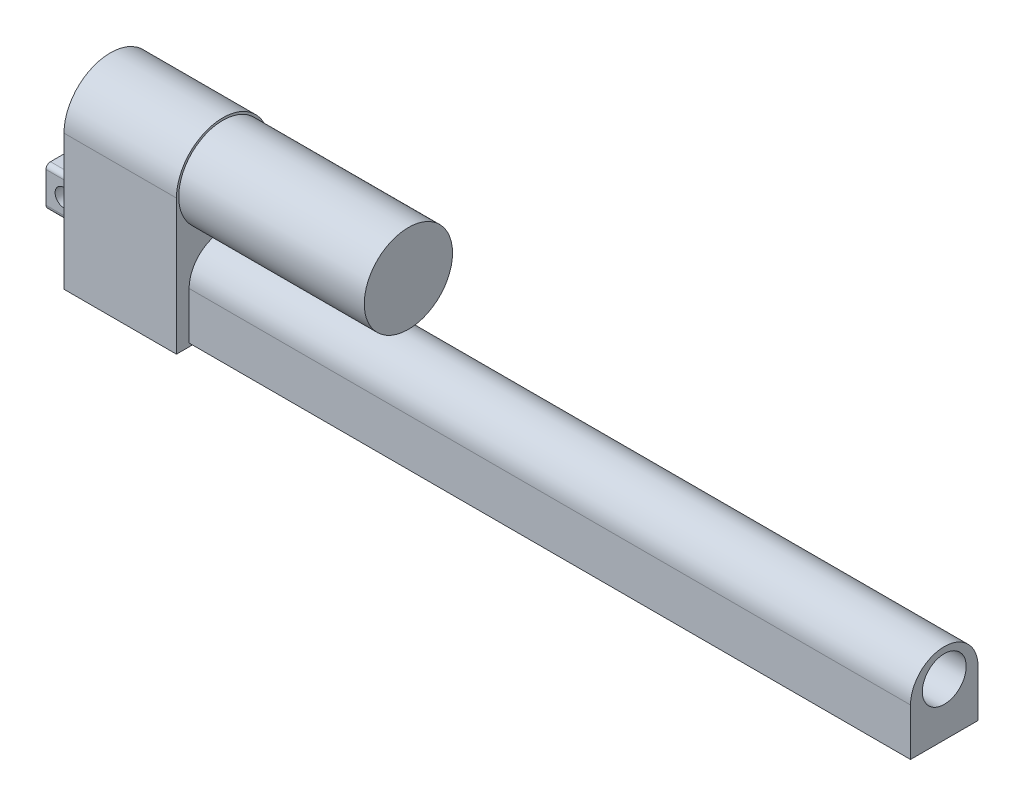
ISO-10303-21;
HEADER;
FILE_DESCRIPTION(('STEP AP214'),'2;1');
FILE_NAME('part.step','',(''),(''),'','','');
FILE_SCHEMA(('AUTOMOTIVE_DESIGN { 1 0 10303 214 1 1 1 1 }'));
ENDSEC;
DATA;
#1=APPLICATION_CONTEXT('core data for automotive mechanical design processes');
#2=APPLICATION_PROTOCOL_DEFINITION('international standard','automotive_design',2000,#1);
#3=PRODUCT_CONTEXT('',#1,'mechanical');
#4=PRODUCT('Part','Part','',(#3));
#5=PRODUCT_RELATED_PRODUCT_CATEGORY('part','',(#4));
#6=PRODUCT_DEFINITION_FORMATION('','',#4);
#7=PRODUCT_DEFINITION_CONTEXT('part definition',#1,'design');
#8=PRODUCT_DEFINITION('design','',#6,#7);
#9=PRODUCT_DEFINITION_SHAPE('','',#8);
#10=(LENGTH_UNIT() NAMED_UNIT(*) SI_UNIT(.MILLI.,.METRE.));
#11=(NAMED_UNIT(*) PLANE_ANGLE_UNIT() SI_UNIT($,.RADIAN.));
#12=(NAMED_UNIT(*) SI_UNIT($,.STERADIAN.) SOLID_ANGLE_UNIT());
#13=UNCERTAINTY_MEASURE_WITH_UNIT(LENGTH_MEASURE(1.E-05),#10,'distance_accuracy_value','');
#14=(GEOMETRIC_REPRESENTATION_CONTEXT(3) GLOBAL_UNCERTAINTY_ASSIGNED_CONTEXT((#13)) GLOBAL_UNIT_ASSIGNED_CONTEXT((#10,
#11,#12)) REPRESENTATION_CONTEXT('',''));
#15=CARTESIAN_POINT('',(0.,0.,0.));
#16=DIRECTION('',(0.,0.,1.));
#17=DIRECTION('',(1.,0.,0.));
#18=AXIS2_PLACEMENT_3D('',#15,#16,#17);
#19=CARTESIAN_POINT('',(0.,0.,0.));
#20=DIRECTION('',(1.,0.,0.));
#21=DIRECTION('',(0.,0.,-1.));
#22=AXIS2_PLACEMENT_3D('',#19,#20,#21);
#23=PLANE('',#22);
#24=CARTESIAN_POINT('',(0.,0.,0.));
#25=DIRECTION('',(1.,0.,0.));
#26=DIRECTION('',(0.,0.,-1.));
#27=AXIS2_PLACEMENT_3D('',#24,#25,#26);
#28=CIRCLE('',#27,20.955);
#29=CARTESIAN_POINT('',(0.,0.,-20.955));
#30=VERTEX_POINT('',#29);
#31=CARTESIAN_POINT('',(0.,0.,20.955));
#32=VERTEX_POINT('',#31);
#33=EDGE_CURVE('E180',#30,#32,#28,.T.);
#34=ORIENTED_EDGE('',*,*,#33,.F.);
#35=DIRECTION('',(0.,1.,0.));
#36=VECTOR('',#35,1.);
#37=CARTESIAN_POINT('',(0.,0.,-20.955));
#38=LINE('',#37,#36);
#39=CARTESIAN_POINT('',(0.,-61.087,-20.955));
#40=VERTEX_POINT('',#39);
#41=EDGE_CURVE('E186',#40,#30,#38,.T.);
#42=ORIENTED_EDGE('',*,*,#41,.F.);
#43=DIRECTION('',(0.,0.,-1.));
#44=VECTOR('',#43,1.);
#45=CARTESIAN_POINT('',(0.,-61.087,20.955));
#46=LINE('',#45,#44);
#47=CARTESIAN_POINT('',(0.,-61.087,20.955));
#48=VERTEX_POINT('',#47);
#49=EDGE_CURVE('E197',#48,#40,#46,.T.);
#50=ORIENTED_EDGE('',*,*,#49,.F.);
#51=DIRECTION('',(0.,-1.,0.));
#52=VECTOR('',#51,1.);
#53=CARTESIAN_POINT('',(0.,0.,20.955));
#54=LINE('',#53,#52);
#55=EDGE_CURVE('E195',#32,#48,#54,.T.);
#56=ORIENTED_EDGE('',*,*,#55,.F.);
#57=EDGE_LOOP('',(#34,#42,#50,#56));
#58=FACE_BOUND('',#57,.T.);
#59=DIRECTION('',(0.,-1.,0.));
#60=VECTOR('',#59,1.);
#61=CARTESIAN_POINT('',(0.,-28.194,-9.017));
#62=LINE('',#61,#60);
#63=CARTESIAN_POINT('',(0.,-30.226,-9.017));
#64=VERTEX_POINT('',#63);
#65=CARTESIAN_POINT('',(0.,-44.196,-9.017));
#66=VERTEX_POINT('',#65);
#67=EDGE_CURVE('E243',#64,#66,#62,.T.);
#68=ORIENTED_EDGE('',*,*,#67,.F.);
#69=CARTESIAN_POINT('',(0.,-30.226,-6.985));
#70=DIRECTION('',(1.,0.,0.));
#71=DIRECTION('',(0.,0.,-1.));
#72=AXIS2_PLACEMENT_3D('',#69,#70,#71);
#73=CIRCLE('',#72,2.032);
#74=CARTESIAN_POINT('',(0.,-28.194,-6.985));
#75=VERTEX_POINT('',#74);
#76=EDGE_CURVE('E41',#64,#75,#73,.T.);
#77=ORIENTED_EDGE('',*,*,#76,.T.);
#78=DIRECTION('',(0.,0.,-1.));
#79=VECTOR('',#78,1.);
#80=CARTESIAN_POINT('',(0.,-28.194,-9.017));
#81=LINE('',#80,#79);
#82=CARTESIAN_POINT('',(0.,-28.194,6.985));
#83=VERTEX_POINT('',#82);
#84=EDGE_CURVE('E273',#83,#75,#81,.T.);
#85=ORIENTED_EDGE('',*,*,#84,.F.);
#86=CARTESIAN_POINT('',(0.,-30.226,6.985));
#87=DIRECTION('',(1.,0.,0.));
#88=DIRECTION('',(0.,0.,-1.));
#89=AXIS2_PLACEMENT_3D('',#86,#87,#88);
#90=CIRCLE('',#89,2.032);
#91=CARTESIAN_POINT('',(0.,-30.226,9.017));
#92=VERTEX_POINT('',#91);
#93=EDGE_CURVE('E11',#83,#92,#90,.T.);
#94=ORIENTED_EDGE('',*,*,#93,.T.);
#95=DIRECTION('',(0.,1.,0.));
#96=VECTOR('',#95,1.);
#97=CARTESIAN_POINT('',(0.,-28.194,9.017));
#98=LINE('',#97,#96);
#99=CARTESIAN_POINT('',(0.,-44.196,9.017));
#100=VERTEX_POINT('',#99);
#101=EDGE_CURVE('E280',#100,#92,#98,.T.);
#102=ORIENTED_EDGE('',*,*,#101,.F.);
#103=CARTESIAN_POINT('',(0.,-44.196,6.98500000000001));
#104=DIRECTION('',(1.,0.,0.));
#105=DIRECTION('',(0.,0.,-1.));
#106=AXIS2_PLACEMENT_3D('',#103,#104,#105);
#107=CIRCLE('',#106,2.032);
#108=CARTESIAN_POINT('',(0.,-46.228,6.98500000000001));
#109=VERTEX_POINT('',#108);
#110=EDGE_CURVE('E238',#100,#109,#107,.T.);
#111=ORIENTED_EDGE('',*,*,#110,.T.);
#112=DIRECTION('',(0.,0.,1.));
#113=VECTOR('',#112,1.);
#114=CARTESIAN_POINT('',(0.,-46.228,-9.017));
#115=LINE('',#114,#113);
#116=CARTESIAN_POINT('',(0.,-46.228,-6.985));
#117=VERTEX_POINT('',#116);
#118=EDGE_CURVE('E245',#117,#109,#115,.T.);
#119=ORIENTED_EDGE('',*,*,#118,.F.);
#120=CARTESIAN_POINT('',(0.,-44.196,-6.985));
#121=DIRECTION('',(1.,0.,0.));
#122=DIRECTION('',(0.,0.,-1.));
#123=AXIS2_PLACEMENT_3D('',#120,#121,#122);
#124=CIRCLE('',#123,2.032);
#125=EDGE_CURVE('E240',#117,#66,#124,.T.);
#126=ORIENTED_EDGE('',*,*,#125,.T.);
#127=EDGE_LOOP('',(#68,#77,#85,#94,#102,#111,#119,#126));
#128=FACE_BOUND('',#127,.T.);
#129=ADVANCED_FACE('F33',(#58,#128),#23,.F.);
#130=CARTESIAN_POINT('',(50.8,0.,0.));
#131=DIRECTION('',(1.,0.,0.));
#132=DIRECTION('',(0.,0.,-1.));
#133=AXIS2_PLACEMENT_3D('',#130,#131,#132);
#134=PLANE('',#133);
#135=CARTESIAN_POINT('',(50.8,0.,0.));
#136=DIRECTION('',(1.,0.,0.));
#137=DIRECTION('',(0.,0.,-1.));
#138=AXIS2_PLACEMENT_3D('',#135,#136,#137);
#139=CIRCLE('',#138,19.939);
#140=CARTESIAN_POINT('',(50.8,0.,-19.939));
#141=VERTEX_POINT('',#140);
#142=EDGE_CURVE('E170',#141,#141,#139,.T.);
#143=ORIENTED_EDGE('',*,*,#142,.F.);
#144=EDGE_LOOP('',(#143));
#145=FACE_BOUND('',#144,.T.);
#146=CARTESIAN_POINT('',(50.8,0.,0.));
#147=DIRECTION('',(1.,0.,0.));
#148=DIRECTION('',(0.,0.,-1.));
#149=AXIS2_PLACEMENT_3D('',#146,#147,#148);
#150=CIRCLE('',#149,20.955);
#151=CARTESIAN_POINT('',(50.8,0.,-20.955));
#152=VERTEX_POINT('',#151);
#153=CARTESIAN_POINT('',(50.8,0.,20.955));
#154=VERTEX_POINT('',#153);
#155=EDGE_CURVE('E182',#152,#154,#150,.T.);
#156=ORIENTED_EDGE('',*,*,#155,.T.);
#157=DIRECTION('',(0.,-1.,0.));
#158=VECTOR('',#157,1.);
#159=CARTESIAN_POINT('',(50.8,0.,20.955));
#160=LINE('',#159,#158);
#161=CARTESIAN_POINT('',(50.8,-61.087,20.955));
#162=VERTEX_POINT('',#161);
#163=EDGE_CURVE('E185',#154,#162,#160,.T.);
#164=ORIENTED_EDGE('',*,*,#163,.T.);
#165=DIRECTION('',(0.,0.,-1.));
#166=VECTOR('',#165,1.);
#167=CARTESIAN_POINT('',(50.8,-61.087,20.955));
#168=LINE('',#167,#166);
#169=CARTESIAN_POINT('',(50.8,-61.087,-20.955));
#170=VERTEX_POINT('',#169);
#171=EDGE_CURVE('E188',#162,#170,#168,.T.);
#172=ORIENTED_EDGE('',*,*,#171,.T.);
#173=DIRECTION('',(0.,1.,0.));
#174=VECTOR('',#173,1.);
#175=CARTESIAN_POINT('',(50.8,0.,-20.955));
#176=LINE('',#175,#174);
#177=EDGE_CURVE('E190',#170,#152,#176,.T.);
#178=ORIENTED_EDGE('',*,*,#177,.T.);
#179=EDGE_LOOP('',(#156,#164,#172,#178));
#180=FACE_BOUND('',#179,.T.);
#181=DIRECTION('',(0.,-1.,0.));
#182=VECTOR('',#181,1.);
#183=CARTESIAN_POINT('',(50.8,-20.066,15.24));
#184=LINE('',#183,#182);
#185=CARTESIAN_POINT('',(50.8,-38.227,15.24));
#186=VERTEX_POINT('',#185);
#187=CARTESIAN_POINT('',(50.8,-59.563,15.24));
#188=VERTEX_POINT('',#187);
#189=EDGE_CURVE('E288',#186,#188,#184,.T.);
#190=ORIENTED_EDGE('',*,*,#189,.F.);
#191=CARTESIAN_POINT('',(50.8,-38.227,0.));
#192=DIRECTION('',(1.,0.,0.));
#193=DIRECTION('',(0.,0.,-1.));
#194=AXIS2_PLACEMENT_3D('',#191,#192,#193);
#195=CIRCLE('',#194,15.24);
#196=CARTESIAN_POINT('',(50.8,-38.227,-15.24));
#197=VERTEX_POINT('',#196);
#198=EDGE_CURVE('E169',#197,#186,#195,.T.);
#199=ORIENTED_EDGE('',*,*,#198,.F.);
#200=DIRECTION('',(0.,-1.,0.));
#201=VECTOR('',#200,1.);
#202=CARTESIAN_POINT('',(50.8,-20.066,-15.24));
#203=LINE('',#202,#201);
#204=CARTESIAN_POINT('',(50.8,-59.563,-15.24));
#205=VERTEX_POINT('',#204);
#206=EDGE_CURVE('E166',#197,#205,#203,.T.);
#207=ORIENTED_EDGE('',*,*,#206,.T.);
#208=DIRECTION('',(0.,0.,-1.));
#209=VECTOR('',#208,1.);
#210=CARTESIAN_POINT('',(50.8,-59.563,-71.7992151243963));
#211=LINE('',#210,#209);
#212=EDGE_CURVE('E290',#188,#205,#211,.T.);
#213=ORIENTED_EDGE('',*,*,#212,.F.);
#214=EDGE_LOOP('',(#190,#199,#207,#213));
#215=FACE_BOUND('',#214,.T.);
#216=ADVANCED_FACE('F302',(#145,#180,#215),#134,.T.);
#217=CARTESIAN_POINT('',(50.8,0.,0.));
#218=DIRECTION('',(-1.,0.,0.));
#219=DIRECTION('',(0.,0.,1.));
#220=AXIS2_PLACEMENT_3D('',#217,#218,#219);
#221=CYLINDRICAL_SURFACE('',#220,20.955);
#222=ORIENTED_EDGE('',*,*,#33,.T.);
#223=DIRECTION('',(-1.,0.,0.));
#224=VECTOR('',#223,1.);
#225=CARTESIAN_POINT('',(50.8,0.,20.955));
#226=LINE('',#225,#224);
#227=EDGE_CURVE('E208',#154,#32,#226,.T.);
#228=ORIENTED_EDGE('',*,*,#227,.F.);
#229=ORIENTED_EDGE('',*,*,#155,.F.);
#230=DIRECTION('',(-1.,0.,0.));
#231=VECTOR('',#230,1.);
#232=CARTESIAN_POINT('',(50.8,0.,-20.955));
#233=LINE('',#232,#231);
#234=EDGE_CURVE('E192',#152,#30,#233,.T.);
#235=ORIENTED_EDGE('',*,*,#234,.T.);
#236=EDGE_LOOP('',(#222,#228,#229,#235));
#237=FACE_BOUND('',#236,.T.);
#238=ADVANCED_FACE('F304',(#237),#221,.T.);
#239=CARTESIAN_POINT('',(50.8,0.,20.955));
#240=DIRECTION('',(0.,0.,-1.));
#241=DIRECTION('',(0.,1.,0.));
#242=AXIS2_PLACEMENT_3D('',#239,#240,#241);
#243=PLANE('',#242);
#244=ORIENTED_EDGE('',*,*,#55,.T.);
#245=DIRECTION('',(-1.,0.,0.));
#246=VECTOR('',#245,1.);
#247=CARTESIAN_POINT('',(50.8,-61.087,20.955));
#248=LINE('',#247,#246);
#249=EDGE_CURVE('E205',#162,#48,#248,.T.);
#250=ORIENTED_EDGE('',*,*,#249,.F.);
#251=ORIENTED_EDGE('',*,*,#163,.F.);
#252=ORIENTED_EDGE('',*,*,#227,.T.);
#253=EDGE_LOOP('',(#244,#250,#251,#252));
#254=FACE_BOUND('',#253,.T.);
#255=ADVANCED_FACE('F311',(#254),#243,.F.);
#256=CARTESIAN_POINT('',(50.8,-61.087,20.955));
#257=DIRECTION('',(0.,1.,0.));
#258=DIRECTION('',(0.,0.,1.));
#259=AXIS2_PLACEMENT_3D('',#256,#257,#258);
#260=PLANE('',#259);
#261=ORIENTED_EDGE('',*,*,#49,.T.);
#262=DIRECTION('',(-1.,0.,0.));
#263=VECTOR('',#262,1.);
#264=CARTESIAN_POINT('',(50.8,-61.087,-20.955));
#265=LINE('',#264,#263);
#266=EDGE_CURVE('E202',#170,#40,#265,.T.);
#267=ORIENTED_EDGE('',*,*,#266,.F.);
#268=ORIENTED_EDGE('',*,*,#171,.F.);
#269=ORIENTED_EDGE('',*,*,#249,.T.);
#270=EDGE_LOOP('',(#261,#267,#268,#269));
#271=FACE_BOUND('',#270,.T.);
#272=ADVANCED_FACE('F325',(#271),#260,.F.);
#273=CARTESIAN_POINT('',(50.8,0.,-20.955));
#274=DIRECTION('',(0.,0.,1.));
#275=DIRECTION('',(0.,-1.,0.));
#276=AXIS2_PLACEMENT_3D('',#273,#274,#275);
#277=PLANE('',#276);
#278=ORIENTED_EDGE('',*,*,#41,.T.);
#279=ORIENTED_EDGE('',*,*,#234,.F.);
#280=ORIENTED_EDGE('',*,*,#177,.F.);
#281=ORIENTED_EDGE('',*,*,#266,.T.);
#282=EDGE_LOOP('',(#278,#279,#280,#281));
#283=FACE_BOUND('',#282,.T.);
#284=ADVANCED_FACE('F322',(#283),#277,.F.);
#285=CARTESIAN_POINT('',(134.62,0.,0.));
#286=DIRECTION('',(-1.,0.,0.));
#287=DIRECTION('',(0.,0.,1.));
#288=AXIS2_PLACEMENT_3D('',#285,#286,#287);
#289=CYLINDRICAL_SURFACE('',#288,19.939);
#290=CARTESIAN_POINT('',(134.62,0.,0.));
#291=DIRECTION('',(1.,0.,0.));
#292=DIRECTION('',(0.,0.,-1.));
#293=AXIS2_PLACEMENT_3D('',#290,#291,#292);
#294=CIRCLE('',#293,19.939);
#295=CARTESIAN_POINT('',(134.62,0.,-19.939));
#296=VERTEX_POINT('',#295);
#297=EDGE_CURVE('E173',#296,#296,#294,.T.);
#298=ORIENTED_EDGE('',*,*,#297,.F.);
#299=EDGE_LOOP('',(#298));
#300=FACE_BOUND('',#299,.T.);
#301=ORIENTED_EDGE('',*,*,#142,.T.);
#302=EDGE_LOOP('',(#301));
#303=FACE_BOUND('',#302,.T.);
#304=ADVANCED_FACE('F319',(#300,#303),#289,.T.);
#305=CARTESIAN_POINT('',(134.62,0.,0.));
#306=DIRECTION('',(1.,0.,0.));
#307=DIRECTION('',(0.,0.,-1.));
#308=AXIS2_PLACEMENT_3D('',#305,#306,#307);
#309=PLANE('',#308);
#310=ORIENTED_EDGE('',*,*,#297,.T.);
#311=EDGE_LOOP('',(#310));
#312=FACE_BOUND('',#311,.T.);
#313=ADVANCED_FACE('F381',(#312),#309,.T.);
#314=CARTESIAN_POINT('',(376.682,-38.227,0.));
#315=DIRECTION('',(-1.,0.,0.));
#316=DIRECTION('',(0.,0.,1.));
#317=AXIS2_PLACEMENT_3D('',#314,#315,#316);
#318=CYLINDRICAL_SURFACE('',#317,15.24);
#319=ORIENTED_EDGE('',*,*,#198,.T.);
#320=DIRECTION('',(-1.,0.,0.));
#321=VECTOR('',#320,1.);
#322=CARTESIAN_POINT('',(376.682,-38.227,15.24));
#323=LINE('',#322,#321);
#324=CARTESIAN_POINT('',(376.682,-38.227,15.24));
#325=VERTEX_POINT('',#324);
#326=EDGE_CURVE('E150',#325,#186,#323,.T.);
#327=ORIENTED_EDGE('',*,*,#326,.F.);
#328=CARTESIAN_POINT('',(376.682,-38.227,0.));
#329=DIRECTION('',(1.,0.,0.));
#330=DIRECTION('',(0.,0.,-1.));
#331=AXIS2_PLACEMENT_3D('',#328,#329,#330);
#332=CIRCLE('',#331,15.24);
#333=CARTESIAN_POINT('',(376.682,-38.227,-15.24));
#334=VERTEX_POINT('',#333);
#335=EDGE_CURVE('E157',#334,#325,#332,.T.);
#336=ORIENTED_EDGE('',*,*,#335,.F.);
#337=DIRECTION('',(-1.,0.,0.));
#338=VECTOR('',#337,1.);
#339=CARTESIAN_POINT('',(376.682,-38.227,-15.24));
#340=LINE('',#339,#338);
#341=EDGE_CURVE('E286',#334,#197,#340,.T.);
#342=ORIENTED_EDGE('',*,*,#341,.T.);
#343=EDGE_LOOP('',(#319,#327,#336,#342));
#344=FACE_BOUND('',#343,.T.);
#345=ADVANCED_FACE('F168',(#344),#318,.T.);
#346=CARTESIAN_POINT('',(376.682,-20.066,15.24));
#347=DIRECTION('',(0.,0.,-1.));
#348=DIRECTION('',(0.,1.,0.));
#349=AXIS2_PLACEMENT_3D('',#346,#347,#348);
#350=PLANE('',#349);
#351=ORIENTED_EDGE('',*,*,#189,.T.);
#352=DIRECTION('',(-1.,0.,0.));
#353=VECTOR('',#352,1.);
#354=CARTESIAN_POINT('',(376.682,-59.563,15.24));
#355=LINE('',#354,#353);
#356=CARTESIAN_POINT('',(376.682,-59.563,15.24));
#357=VERTEX_POINT('',#356);
#358=EDGE_CURVE('E153',#357,#188,#355,.T.);
#359=ORIENTED_EDGE('',*,*,#358,.F.);
#360=DIRECTION('',(0.,-1.,0.));
#361=VECTOR('',#360,1.);
#362=CARTESIAN_POINT('',(376.682,-20.066,15.24));
#363=LINE('',#362,#361);
#364=EDGE_CURVE('E145',#325,#357,#363,.T.);
#365=ORIENTED_EDGE('',*,*,#364,.F.);
#366=ORIENTED_EDGE('',*,*,#326,.T.);
#367=EDGE_LOOP('',(#351,#359,#365,#366));
#368=FACE_BOUND('',#367,.T.);
#369=ADVANCED_FACE('F148',(#368),#350,.F.);
#370=CARTESIAN_POINT('',(376.682,-59.563,-71.7992151243963));
#371=DIRECTION('',(0.,1.,0.));
#372=DIRECTION('',(0.,0.,1.));
#373=AXIS2_PLACEMENT_3D('',#370,#371,#372);
#374=PLANE('',#373);
#375=ORIENTED_EDGE('',*,*,#212,.T.);
#376=DIRECTION('',(-1.,0.,0.));
#377=VECTOR('',#376,1.);
#378=CARTESIAN_POINT('',(376.682,-59.563,-15.24));
#379=LINE('',#378,#377);
#380=CARTESIAN_POINT('',(376.682,-59.563,-15.24));
#381=VERTEX_POINT('',#380);
#382=EDGE_CURVE('E175',#381,#205,#379,.T.);
#383=ORIENTED_EDGE('',*,*,#382,.F.);
#384=DIRECTION('',(0.,0.,-1.));
#385=VECTOR('',#384,1.);
#386=CARTESIAN_POINT('',(376.682,-59.563,-71.7992151243963));
#387=LINE('',#386,#385);
#388=EDGE_CURVE('E156',#357,#381,#387,.T.);
#389=ORIENTED_EDGE('',*,*,#388,.F.);
#390=ORIENTED_EDGE('',*,*,#358,.T.);
#391=EDGE_LOOP('',(#375,#383,#389,#390));
#392=FACE_BOUND('',#391,.T.);
#393=ADVANCED_FACE('F300',(#392),#374,.F.);
#394=CARTESIAN_POINT('',(376.682,-20.066,-15.24));
#395=DIRECTION('',(0.,0.,-1.));
#396=DIRECTION('',(0.,1.,0.));
#397=AXIS2_PLACEMENT_3D('',#394,#395,#396);
#398=PLANE('',#397);
#399=ORIENTED_EDGE('',*,*,#206,.F.);
#400=ORIENTED_EDGE('',*,*,#341,.F.);
#401=DIRECTION('',(0.,-1.,0.));
#402=VECTOR('',#401,1.);
#403=CARTESIAN_POINT('',(376.682,-20.066,-15.24));
#404=LINE('',#403,#402);
#405=EDGE_CURVE('E163',#334,#381,#404,.T.);
#406=ORIENTED_EDGE('',*,*,#405,.T.);
#407=ORIENTED_EDGE('',*,*,#382,.T.);
#408=EDGE_LOOP('',(#399,#400,#406,#407));
#409=FACE_BOUND('',#408,.T.);
#410=ADVANCED_FACE('F298',(#409),#398,.T.);
#411=CARTESIAN_POINT('',(376.682,-20.066,-71.7992151243963));
#412=DIRECTION('',(1.,0.,0.));
#413=DIRECTION('',(0.,0.,-1.));
#414=AXIS2_PLACEMENT_3D('',#411,#412,#413);
#415=PLANE('',#414);
#416=CARTESIAN_POINT('',(376.682,-35.687,0.));
#417=DIRECTION('',(1.,0.,0.));
#418=DIRECTION('',(0.,0.,-1.));
#419=AXIS2_PLACEMENT_3D('',#416,#417,#418);
#420=CIRCLE('',#419,9.906);
#421=CARTESIAN_POINT('',(376.682,-35.687,-9.906));
#422=VERTEX_POINT('',#421);
#423=EDGE_CURVE('E539',#422,#422,#420,.T.);
#424=ORIENTED_EDGE('',*,*,#423,.F.);
#425=EDGE_LOOP('',(#424));
#426=FACE_BOUND('',#425,.T.);
#427=ORIENTED_EDGE('',*,*,#335,.T.);
#428=ORIENTED_EDGE('',*,*,#364,.T.);
#429=ORIENTED_EDGE('',*,*,#388,.T.);
#430=ORIENTED_EDGE('',*,*,#405,.F.);
#431=EDGE_LOOP('',(#427,#428,#429,#430));
#432=FACE_BOUND('',#431,.T.);
#433=ADVANCED_FACE('F161',(#426,#432),#415,.T.);
#434=CARTESIAN_POINT('',(-20.066,-28.194,-9.017));
#435=DIRECTION('',(0.,0.,1.));
#436=DIRECTION('',(0.,-1.,0.));
#437=AXIS2_PLACEMENT_3D('',#434,#435,#436);
#438=PLANE('',#437);
#439=CARTESIAN_POINT('',(-11.938,-37.211,-9.017));
#440=DIRECTION('',(0.,0.,1.));
#441=DIRECTION('',(0.,-1.,0.));
#442=AXIS2_PLACEMENT_3D('',#439,#440,#441);
#443=CIRCLE('',#442,4.0132);
#444=CARTESIAN_POINT('',(-11.938,-41.2242,-9.017));
#445=VERTEX_POINT('',#444);
#446=EDGE_CURVE('E254',#445,#445,#443,.T.);
#447=ORIENTED_EDGE('',*,*,#446,.T.);
#448=EDGE_LOOP('',(#447));
#449=FACE_BOUND('',#448,.T.);
#450=ORIENTED_EDGE('',*,*,#67,.T.);
#451=DIRECTION('',(1.,0.,0.));
#452=VECTOR('',#451,1.);
#453=CARTESIAN_POINT('',(-20.066,-44.196,-9.017));
#454=LINE('',#453,#452);
#455=CARTESIAN_POINT('',(-20.066,-44.196,-9.017));
#456=VERTEX_POINT('',#455);
#457=EDGE_CURVE('E232',#66,#456,#454,.F.);
#458=ORIENTED_EDGE('',*,*,#457,.T.);
#459=DIRECTION('',(0.,-1.,0.));
#460=VECTOR('',#459,1.);
#461=CARTESIAN_POINT('',(-20.066,-28.194,-9.017));
#462=LINE('',#461,#460);
#463=CARTESIAN_POINT('',(-20.066,-30.226,-9.017));
#464=VERTEX_POINT('',#463);
#465=EDGE_CURVE('E264',#464,#456,#462,.T.);
#466=ORIENTED_EDGE('',*,*,#465,.F.);
#467=DIRECTION('',(1.,0.,0.));
#468=VECTOR('',#467,1.);
#469=CARTESIAN_POINT('',(-20.066,-30.226,-9.017));
#470=LINE('',#469,#468);
#471=EDGE_CURVE('E229',#464,#64,#470,.T.);
#472=ORIENTED_EDGE('',*,*,#471,.T.);
#473=EDGE_LOOP('',(#450,#458,#466,#472));
#474=FACE_BOUND('',#473,.T.);
#475=ADVANCED_FACE('F250',(#449,#474),#438,.F.);
#476=CARTESIAN_POINT('',(-20.066,-46.228,-9.017));
#477=DIRECTION('',(0.,1.,0.));
#478=DIRECTION('',(0.,0.,1.));
#479=AXIS2_PLACEMENT_3D('',#476,#477,#478);
#480=PLANE('',#479);
#481=ORIENTED_EDGE('',*,*,#118,.T.);
#482=DIRECTION('',(1.,0.,0.));
#483=VECTOR('',#482,1.);
#484=CARTESIAN_POINT('',(-20.066,-46.228,6.98500000000001));
#485=LINE('',#484,#483);
#486=CARTESIAN_POINT('',(-20.066,-46.228,6.98500000000001));
#487=VERTEX_POINT('',#486);
#488=EDGE_CURVE('E219',#109,#487,#485,.F.);
#489=ORIENTED_EDGE('',*,*,#488,.T.);
#490=DIRECTION('',(0.,0.,1.));
#491=VECTOR('',#490,1.);
#492=CARTESIAN_POINT('',(-20.066,-46.228,-9.017));
#493=LINE('',#492,#491);
#494=CARTESIAN_POINT('',(-20.066,-46.228,-6.985));
#495=VERTEX_POINT('',#494);
#496=EDGE_CURVE('E262',#495,#487,#493,.T.);
#497=ORIENTED_EDGE('',*,*,#496,.F.);
#498=DIRECTION('',(1.,0.,0.));
#499=VECTOR('',#498,1.);
#500=CARTESIAN_POINT('',(-20.066,-46.228,-6.985));
#501=LINE('',#500,#499);
#502=EDGE_CURVE('E216',#495,#117,#501,.T.);
#503=ORIENTED_EDGE('',*,*,#502,.T.);
#504=EDGE_LOOP('',(#481,#489,#497,#503));
#505=FACE_BOUND('',#504,.T.);
#506=ADVANCED_FACE('F266',(#505),#480,.F.);
#507=CARTESIAN_POINT('',(-20.066,-28.194,9.017));
#508=DIRECTION('',(0.,0.,-1.));
#509=DIRECTION('',(0.,1.,0.));
#510=AXIS2_PLACEMENT_3D('',#507,#508,#509);
#511=PLANE('',#510);
#512=CARTESIAN_POINT('',(-11.938,-37.211,9.01699999999999));
#513=DIRECTION('',(0.,0.,1.));
#514=DIRECTION('',(1.,0.,0.));
#515=AXIS2_PLACEMENT_3D('',#512,#513,#514);
#516=CIRCLE('',#515,4.0132);
#517=CARTESIAN_POINT('',(-7.9248,-37.211,9.01699999999999));
#518=VERTEX_POINT('',#517);
#519=EDGE_CURVE('E538',#518,#518,#516,.T.);
#520=ORIENTED_EDGE('',*,*,#519,.F.);
#521=EDGE_LOOP('',(#520));
#522=FACE_BOUND('',#521,.T.);
#523=DIRECTION('',(0.,1.,0.));
#524=VECTOR('',#523,1.);
#525=CARTESIAN_POINT('',(-20.066,-28.194,9.017));
#526=LINE('',#525,#524);
#527=CARTESIAN_POINT('',(-20.066,-44.196,9.017));
#528=VERTEX_POINT('',#527);
#529=CARTESIAN_POINT('',(-20.066,-30.226,9.017));
#530=VERTEX_POINT('',#529);
#531=EDGE_CURVE('E268',#528,#530,#526,.T.);
#532=ORIENTED_EDGE('',*,*,#531,.F.);
#533=DIRECTION('',(1.,0.,0.));
#534=VECTOR('',#533,1.);
#535=CARTESIAN_POINT('',(-20.066,-44.196,9.017));
#536=LINE('',#535,#534);
#537=EDGE_CURVE('E213',#528,#100,#536,.T.);
#538=ORIENTED_EDGE('',*,*,#537,.T.);
#539=ORIENTED_EDGE('',*,*,#101,.T.);
#540=DIRECTION('',(1.,0.,0.));
#541=VECTOR('',#540,1.);
#542=CARTESIAN_POINT('',(-20.066,-30.226,9.017));
#543=LINE('',#542,#541);
#544=EDGE_CURVE('E211',#92,#530,#543,.F.);
#545=ORIENTED_EDGE('',*,*,#544,.T.);
#546=EDGE_LOOP('',(#532,#538,#539,#545));
#547=FACE_BOUND('',#546,.T.);
#548=ADVANCED_FACE('F353',(#522,#547),#511,.F.);
#549=CARTESIAN_POINT('',(-20.066,-28.194,-9.017));
#550=DIRECTION('',(0.,-1.,0.));
#551=DIRECTION('',(0.,0.,-1.));
#552=AXIS2_PLACEMENT_3D('',#549,#550,#551);
#553=PLANE('',#552);
#554=ORIENTED_EDGE('',*,*,#84,.T.);
#555=DIRECTION('',(1.,0.,0.));
#556=VECTOR('',#555,1.);
#557=CARTESIAN_POINT('',(-20.066,-28.194,-6.985));
#558=LINE('',#557,#556);
#559=CARTESIAN_POINT('',(-20.066,-28.194,-6.985));
#560=VERTEX_POINT('',#559);
#561=EDGE_CURVE('E236',#75,#560,#558,.F.);
#562=ORIENTED_EDGE('',*,*,#561,.T.);
#563=DIRECTION('',(0.,0.,-1.));
#564=VECTOR('',#563,1.);
#565=CARTESIAN_POINT('',(-20.066,-28.194,-9.017));
#566=LINE('',#565,#564);
#567=CARTESIAN_POINT('',(-20.066,-28.194,6.985));
#568=VERTEX_POINT('',#567);
#569=EDGE_CURVE('E271',#568,#560,#566,.T.);
#570=ORIENTED_EDGE('',*,*,#569,.F.);
#571=DIRECTION('',(1.,0.,0.));
#572=VECTOR('',#571,1.);
#573=CARTESIAN_POINT('',(-20.066,-28.194,6.985));
#574=LINE('',#573,#572);
#575=EDGE_CURVE('E234',#568,#83,#574,.T.);
#576=ORIENTED_EDGE('',*,*,#575,.T.);
#577=EDGE_LOOP('',(#554,#562,#570,#576));
#578=FACE_BOUND('',#577,.T.);
#579=ADVANCED_FACE('F350',(#578),#553,.F.);
#580=CARTESIAN_POINT('',(-20.066,-46.228,-9.017));
#581=DIRECTION('',(-1.,0.,0.));
#582=DIRECTION('',(0.,0.,1.));
#583=AXIS2_PLACEMENT_3D('',#580,#581,#582);
#584=PLANE('',#583);
#585=ORIENTED_EDGE('',*,*,#496,.T.);
#586=CARTESIAN_POINT('',(-20.066,-44.196,6.98500000000001));
#587=DIRECTION('',(-1.,0.,0.));
#588=DIRECTION('',(0.,0.,1.));
#589=AXIS2_PLACEMENT_3D('',#586,#587,#588);
#590=CIRCLE('',#589,2.032);
#591=EDGE_CURVE('E227',#487,#528,#590,.T.);
#592=ORIENTED_EDGE('',*,*,#591,.T.);
#593=ORIENTED_EDGE('',*,*,#531,.T.);
#594=CARTESIAN_POINT('',(-20.066,-30.226,6.985));
#595=DIRECTION('',(-1.,0.,0.));
#596=DIRECTION('',(0.,0.,1.));
#597=AXIS2_PLACEMENT_3D('',#594,#595,#596);
#598=CIRCLE('',#597,2.032);
#599=EDGE_CURVE('E221',#530,#568,#598,.T.);
#600=ORIENTED_EDGE('',*,*,#599,.T.);
#601=ORIENTED_EDGE('',*,*,#569,.T.);
#602=CARTESIAN_POINT('',(-20.066,-30.226,-6.985));
#603=DIRECTION('',(-1.,0.,0.));
#604=DIRECTION('',(0.,0.,1.));
#605=AXIS2_PLACEMENT_3D('',#602,#603,#604);
#606=CIRCLE('',#605,2.032);
#607=EDGE_CURVE('E223',#560,#464,#606,.T.);
#608=ORIENTED_EDGE('',*,*,#607,.T.);
#609=ORIENTED_EDGE('',*,*,#465,.T.);
#610=CARTESIAN_POINT('',(-20.066,-44.196,-6.985));
#611=DIRECTION('',(-1.,0.,0.));
#612=DIRECTION('',(0.,0.,1.));
#613=AXIS2_PLACEMENT_3D('',#610,#611,#612);
#614=CIRCLE('',#613,2.032);
#615=EDGE_CURVE('E225',#456,#495,#614,.T.);
#616=ORIENTED_EDGE('',*,*,#615,.T.);
#617=EDGE_LOOP('',(#585,#592,#593,#600,#601,#608,#609,#616));
#618=FACE_BOUND('',#617,.T.);
#619=ADVANCED_FACE('F261',(#618),#584,.T.);
#620=CARTESIAN_POINT('',(-20.066,-44.196,6.98500000000001));
#621=DIRECTION('',(1.,0.,0.));
#622=DIRECTION('',(0.,0.,-1.));
#623=AXIS2_PLACEMENT_3D('',#620,#621,#622);
#624=CYLINDRICAL_SURFACE('',#623,2.032);
#625=ORIENTED_EDGE('',*,*,#591,.F.);
#626=ORIENTED_EDGE('',*,*,#488,.F.);
#627=ORIENTED_EDGE('',*,*,#110,.F.);
#628=ORIENTED_EDGE('',*,*,#537,.F.);
#629=EDGE_LOOP('',(#625,#626,#627,#628));
#630=FACE_BOUND('',#629,.T.);
#631=ADVANCED_FACE('F333',(#630),#624,.T.);
#632=CARTESIAN_POINT('',(-20.066,-44.196,-6.985));
#633=DIRECTION('',(1.,0.,0.));
#634=DIRECTION('',(0.,0.,-1.));
#635=AXIS2_PLACEMENT_3D('',#632,#633,#634);
#636=CYLINDRICAL_SURFACE('',#635,2.032);
#637=ORIENTED_EDGE('',*,*,#615,.F.);
#638=ORIENTED_EDGE('',*,*,#457,.F.);
#639=ORIENTED_EDGE('',*,*,#125,.F.);
#640=ORIENTED_EDGE('',*,*,#502,.F.);
#641=EDGE_LOOP('',(#637,#638,#639,#640));
#642=FACE_BOUND('',#641,.T.);
#643=ADVANCED_FACE('F257',(#642),#636,.T.);
#644=CARTESIAN_POINT('',(-20.066,-30.226,-6.985));
#645=DIRECTION('',(1.,0.,0.));
#646=DIRECTION('',(0.,0.,-1.));
#647=AXIS2_PLACEMENT_3D('',#644,#645,#646);
#648=CYLINDRICAL_SURFACE('',#647,2.032);
#649=ORIENTED_EDGE('',*,*,#607,.F.);
#650=ORIENTED_EDGE('',*,*,#561,.F.);
#651=ORIENTED_EDGE('',*,*,#76,.F.);
#652=ORIENTED_EDGE('',*,*,#471,.F.);
#653=EDGE_LOOP('',(#649,#650,#651,#652));
#654=FACE_BOUND('',#653,.T.);
#655=ADVANCED_FACE('F338',(#654),#648,.T.);
#656=CARTESIAN_POINT('',(-20.066,-30.226,6.985));
#657=DIRECTION('',(1.,0.,0.));
#658=DIRECTION('',(0.,0.,-1.));
#659=AXIS2_PLACEMENT_3D('',#656,#657,#658);
#660=CYLINDRICAL_SURFACE('',#659,2.032);
#661=ORIENTED_EDGE('',*,*,#599,.F.);
#662=ORIENTED_EDGE('',*,*,#544,.F.);
#663=ORIENTED_EDGE('',*,*,#93,.F.);
#664=ORIENTED_EDGE('',*,*,#575,.F.);
#665=EDGE_LOOP('',(#661,#662,#663,#664));
#666=FACE_BOUND('',#665,.T.);
#667=ADVANCED_FACE('F35',(#666),#660,.T.);
#668=CARTESIAN_POINT('',(-11.938,-37.211,-20.955));
#669=DIRECTION('',(0.,0.,1.));
#670=DIRECTION('',(1.,0.,0.));
#671=AXIS2_PLACEMENT_3D('',#668,#669,#670);
#672=CYLINDRICAL_SURFACE('',#671,4.0132);
#673=ORIENTED_EDGE('',*,*,#519,.T.);
#674=EDGE_LOOP('',(#673));
#675=FACE_BOUND('',#674,.T.);
#676=ORIENTED_EDGE('',*,*,#446,.F.);
#677=EDGE_LOOP('',(#676));
#678=FACE_BOUND('',#677,.T.);
#679=ADVANCED_FACE('F344',(#675,#678),#672,.F.);
#680=CARTESIAN_POINT('',(59.182,-35.687,0.));
#681=DIRECTION('',(1.,0.,0.));
#682=DIRECTION('',(0.,0.,-1.));
#683=AXIS2_PLACEMENT_3D('',#680,#681,#682);
#684=CYLINDRICAL_SURFACE('',#683,9.906);
#685=CARTESIAN_POINT('',(59.182,-35.687,0.));
#686=DIRECTION('',(1.,0.,0.));
#687=DIRECTION('',(0.,0.,-1.));
#688=AXIS2_PLACEMENT_3D('',#685,#686,#687);
#689=CIRCLE('',#688,9.906);
#690=CARTESIAN_POINT('',(59.182,-35.687,-9.906));
#691=VERTEX_POINT('',#690);
#692=EDGE_CURVE('E537',#691,#691,#689,.T.);
#693=CARTESIAN_POINT('',(59.182,-35.687,-9.906));
#694=CARTESIAN_POINT('',(62.4892916666667,-35.687,-9.906));
#695=CARTESIAN_POINT('',(65.7965833333333,-35.687,-9.906));
#696=CARTESIAN_POINT('',(72.4111666666667,-35.687,-9.906));
#697=CARTESIAN_POINT('',(75.7184583333333,-35.687,-9.906));
#698=CARTESIAN_POINT('',(82.3330416666667,-35.687,-9.906));
#699=CARTESIAN_POINT('',(85.6403333333333,-35.687,-9.906));
#700=CARTESIAN_POINT('',(92.2549166666667,-35.687,-9.906));
#701=CARTESIAN_POINT('',(95.5622083333333,-35.687,-9.906));
#702=CARTESIAN_POINT('',(102.176791666667,-35.687,-9.906));
#703=CARTESIAN_POINT('',(105.484083333333,-35.687,-9.906));
#704=CARTESIAN_POINT('',(112.098666666667,-35.687,-9.906));
#705=CARTESIAN_POINT('',(115.405958333333,-35.687,-9.906));
#706=CARTESIAN_POINT('',(122.020541666667,-35.687,-9.906));
#707=CARTESIAN_POINT('',(125.327833333333,-35.687,-9.906));
#708=CARTESIAN_POINT('',(131.942416666667,-35.687,-9.906));
#709=CARTESIAN_POINT('',(135.249708333333,-35.687,-9.906));
#710=CARTESIAN_POINT('',(141.864291666667,-35.687,-9.906));
#711=CARTESIAN_POINT('',(145.171583333333,-35.687,-9.906));
#712=CARTESIAN_POINT('',(151.786166666667,-35.687,-9.906));
#713=CARTESIAN_POINT('',(155.093458333333,-35.687,-9.906));
#714=CARTESIAN_POINT('',(161.708041666667,-35.687,-9.906));
#715=CARTESIAN_POINT('',(165.015333333333,-35.687,-9.906));
#716=CARTESIAN_POINT('',(171.629916666667,-35.687,-9.906));
#717=CARTESIAN_POINT('',(174.937208333333,-35.687,-9.906));
#718=CARTESIAN_POINT('',(181.551791666667,-35.687,-9.906));
#719=CARTESIAN_POINT('',(184.859083333333,-35.687,-9.906));
#720=CARTESIAN_POINT('',(191.473666666667,-35.687,-9.906));
#721=CARTESIAN_POINT('',(194.780958333333,-35.687,-9.906));
#722=CARTESIAN_POINT('',(201.395541666667,-35.687,-9.906));
#723=CARTESIAN_POINT('',(204.702833333333,-35.687,-9.906));
#724=CARTESIAN_POINT('',(211.317416666667,-35.687,-9.906));
#725=CARTESIAN_POINT('',(214.624708333333,-35.687,-9.906));
#726=CARTESIAN_POINT('',(221.239291666667,-35.687,-9.906));
#727=CARTESIAN_POINT('',(224.546583333333,-35.687,-9.906));
#728=CARTESIAN_POINT('',(231.161166666667,-35.687,-9.906));
#729=CARTESIAN_POINT('',(234.468458333333,-35.687,-9.906));
#730=CARTESIAN_POINT('',(241.083041666667,-35.687,-9.906));
#731=CARTESIAN_POINT('',(244.390333333333,-35.687,-9.906));
#732=CARTESIAN_POINT('',(251.004916666667,-35.687,-9.906));
#733=CARTESIAN_POINT('',(254.312208333333,-35.687,-9.906));
#734=CARTESIAN_POINT('',(260.926791666667,-35.687,-9.906));
#735=CARTESIAN_POINT('',(264.234083333333,-35.687,-9.906));
#736=CARTESIAN_POINT('',(270.848666666667,-35.687,-9.906));
#737=CARTESIAN_POINT('',(274.155958333333,-35.687,-9.906));
#738=CARTESIAN_POINT('',(280.770541666667,-35.687,-9.906));
#739=CARTESIAN_POINT('',(284.077833333333,-35.687,-9.906));
#740=CARTESIAN_POINT('',(290.692416666667,-35.687,-9.906));
#741=CARTESIAN_POINT('',(293.999708333333,-35.687,-9.906));
#742=CARTESIAN_POINT('',(300.614291666667,-35.687,-9.906));
#743=CARTESIAN_POINT('',(303.921583333333,-35.687,-9.906));
#744=CARTESIAN_POINT('',(310.536166666667,-35.687,-9.906));
#745=CARTESIAN_POINT('',(313.843458333333,-35.687,-9.906));
#746=CARTESIAN_POINT('',(320.458041666667,-35.687,-9.906));
#747=CARTESIAN_POINT('',(323.765333333333,-35.687,-9.906));
#748=CARTESIAN_POINT('',(330.379916666667,-35.687,-9.906));
#749=CARTESIAN_POINT('',(333.687208333333,-35.687,-9.906));
#750=CARTESIAN_POINT('',(340.301791666667,-35.687,-9.906));
#751=CARTESIAN_POINT('',(343.609083333333,-35.687,-9.906));
#752=CARTESIAN_POINT('',(350.223666666667,-35.687,-9.906));
#753=CARTESIAN_POINT('',(353.530958333333,-35.687,-9.906));
#754=CARTESIAN_POINT('',(360.145541666667,-35.687,-9.906));
#755=CARTESIAN_POINT('',(363.452833333333,-35.687,-9.906));
#756=CARTESIAN_POINT('',(370.067416666667,-35.687,-9.906));
#757=CARTESIAN_POINT('',(373.374708333333,-35.687,-9.906));
#758=CARTESIAN_POINT('',(376.682,-35.687,-9.906));
#759=B_SPLINE_CURVE_WITH_KNOTS('',3,(#693,#694,#695,#696,#697,#698,#699,#700,#701,#702,#703,
#704,#705,#706,#707,#708,#709,#710,#711,#712,#713,#714,#715,#716,#717,#718,#719,#720,#721,#722,
#723,#724,#725,#726,#727,#728,#729,#730,#731,#732,#733,#734,#735,#736,#737,#738,#739,#740,#741,
#742,#743,#744,#745,#746,#747,#748,#749,#750,#751,#752,#753,#754,#755,#756,#757,#758),
.UNSPECIFIED.,.F.,.F.,(4,2,2,2,2,2,2,2,2,2,2,2,2,2,2,2,2,2,2,2,2,2,2,2,2,2,2,2,2,2,2,2,4),(0.,
9.921875,19.84375,29.765625,39.6875,49.609375,59.53125,69.453125,79.375,89.296875,99.21875,
109.140625,119.0625,128.984375,138.90625,148.828125,158.75,168.671875,178.59375,188.515625,
198.4375,208.359375,218.28125,228.203125,238.125,248.046875,257.96875,267.890625,277.8125,
287.734375,297.65625,307.578125,317.5),.UNSPECIFIED.);
#760=EDGE_CURVE('BSEAM512',#691,#422,#759,.T.);
#761=ORIENTED_EDGE('',*,*,#692,.F.);
#762=ORIENTED_EDGE('',*,*,#423,.T.);
#763=ORIENTED_EDGE('',*,*,#760,.T.);
#764=ORIENTED_EDGE('',*,*,#760,.F.);
#765=EDGE_LOOP('',(#761,#763,#762,#764));
#766=FACE_BOUND('',#765,.T.);
#767=ADVANCED_FACE('F512',(#766),#684,.F.);
#768=CARTESIAN_POINT('',(59.182,-35.687,0.));
#769=DIRECTION('',(1.,0.,0.));
#770=DIRECTION('',(0.,0.,-1.));
#771=AXIS2_PLACEMENT_3D('',#768,#769,#770);
#772=PLANE('',#771);
#773=ORIENTED_EDGE('',*,*,#692,.T.);
#774=EDGE_LOOP('',(#773));
#775=FACE_BOUND('',#774,.T.);
#776=ADVANCED_FACE('F520',(#775),#772,.T.);
#777=CLOSED_SHELL('',(#129,#216,#238,#255,#272,#284,#304,#313,#345,#369,#393,#410,#433,#475,
#506,#548,#579,#619,#631,#643,#655,#667,#679,#767,#776));
#778=MANIFOLD_SOLID_BREP('B2',#777);
#779=ADVANCED_BREP_SHAPE_REPRESENTATION('',(#18,#778),#14);
#780=SHAPE_DEFINITION_REPRESENTATION(#9,#779);
ENDSEC;
END-ISO-10303-21;
